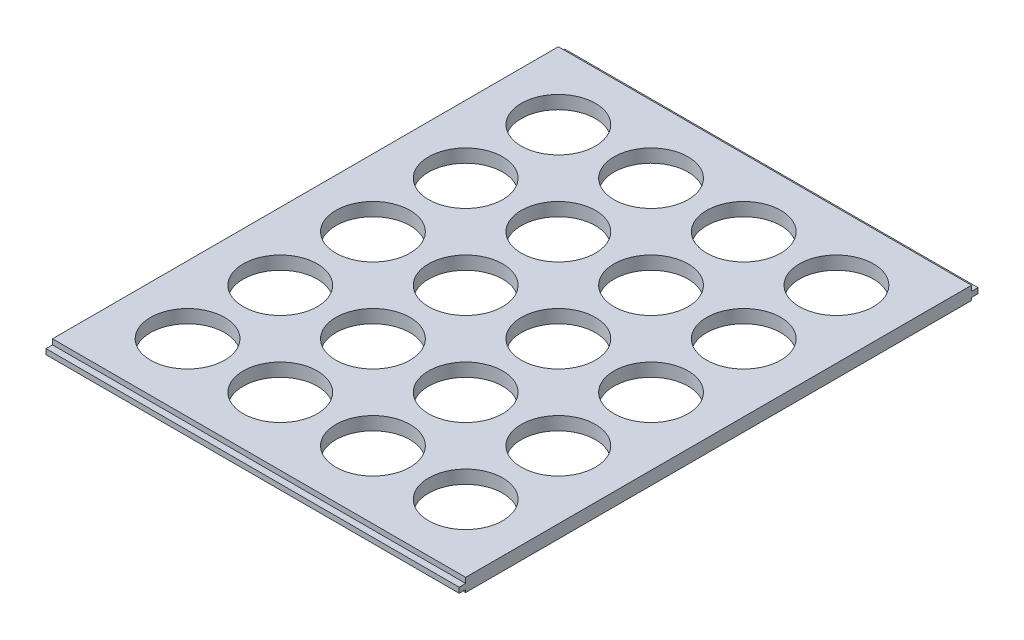
ISO-10303-21;
HEADER;
FILE_DESCRIPTION(('STEP AP214'),'2;1');
FILE_NAME('part.step','',(''),(''),'','','');
FILE_SCHEMA(('AUTOMOTIVE_DESIGN { 1 0 10303 214 1 1 1 1 }'));
ENDSEC;
DATA;
#1=APPLICATION_CONTEXT('core data for automotive mechanical design processes');
#2=APPLICATION_PROTOCOL_DEFINITION('international standard','automotive_design',2000,#1);
#3=PRODUCT_CONTEXT('',#1,'mechanical');
#4=PRODUCT('Part','Part','',(#3));
#5=PRODUCT_RELATED_PRODUCT_CATEGORY('part','',(#4));
#6=PRODUCT_DEFINITION_FORMATION('','',#4);
#7=PRODUCT_DEFINITION_CONTEXT('part definition',#1,'design');
#8=PRODUCT_DEFINITION('design','',#6,#7);
#9=PRODUCT_DEFINITION_SHAPE('','',#8);
#10=(LENGTH_UNIT() NAMED_UNIT(*) SI_UNIT(.MILLI.,.METRE.));
#11=(NAMED_UNIT(*) PLANE_ANGLE_UNIT() SI_UNIT($,.RADIAN.));
#12=(NAMED_UNIT(*) SI_UNIT($,.STERADIAN.) SOLID_ANGLE_UNIT());
#13=UNCERTAINTY_MEASURE_WITH_UNIT(LENGTH_MEASURE(1.E-05),#10,'distance_accuracy_value','');
#14=(GEOMETRIC_REPRESENTATION_CONTEXT(3) GLOBAL_UNCERTAINTY_ASSIGNED_CONTEXT((#13)) GLOBAL_UNIT_ASSIGNED_CONTEXT((#10,
#11,#12)) REPRESENTATION_CONTEXT('',''));
#15=CARTESIAN_POINT('',(0.,0.,0.));
#16=DIRECTION('',(0.,0.,1.));
#17=DIRECTION('',(1.,0.,0.));
#18=AXIS2_PLACEMENT_3D('',#15,#16,#17);
#19=CARTESIAN_POINT('',(0.,5.,0.));
#20=DIRECTION('',(0.,0.,1.));
#21=DIRECTION('',(1.,0.,0.));
#22=AXIS2_PLACEMENT_3D('',#19,#20,#21);
#23=PLANE('',#22);
#24=DIRECTION('',(1.,0.,0.));
#25=VECTOR('',#24,1.);
#26=CARTESIAN_POINT('',(156.,3.,0.));
#27=LINE('',#26,#25);
#28=CARTESIAN_POINT('',(0.,3.,0.));
#29=VERTEX_POINT('',#28);
#30=CARTESIAN_POINT('',(156.,3.,0.));
#31=VERTEX_POINT('',#30);
#32=EDGE_CURVE('E143',#29,#31,#27,.T.);
#33=ORIENTED_EDGE('',*,*,#32,.F.);
#34=DIRECTION('',(0.,-1.,0.));
#35=VECTOR('',#34,1.);
#36=CARTESIAN_POINT('',(0.,5.,0.));
#37=LINE('',#36,#35);
#38=CARTESIAN_POINT('',(0.,5.,0.));
#39=VERTEX_POINT('',#38);
#40=EDGE_CURVE('E321',#39,#29,#37,.T.);
#41=ORIENTED_EDGE('',*,*,#40,.F.);
#42=DIRECTION('',(-1.,0.,0.));
#43=VECTOR('',#42,1.);
#44=CARTESIAN_POINT('',(0.,5.,0.));
#45=LINE('',#44,#43);
#46=CARTESIAN_POINT('',(156.,5.,0.));
#47=VERTEX_POINT('',#46);
#48=EDGE_CURVE('E309',#47,#39,#45,.T.);
#49=ORIENTED_EDGE('',*,*,#48,.F.);
#50=DIRECTION('',(0.,-1.,0.));
#51=VECTOR('',#50,1.);
#52=CARTESIAN_POINT('',(156.,5.,0.));
#53=LINE('',#52,#51);
#54=EDGE_CURVE('E58',#47,#31,#53,.T.);
#55=ORIENTED_EDGE('',*,*,#54,.T.);
#56=EDGE_LOOP('',(#33,#41,#49,#55));
#57=FACE_BOUND('',#56,.T.);
#58=ADVANCED_FACE('F35',(#57),#23,.F.);
#59=DIRECTION('',(-1.,0.,0.));
#60=VECTOR('',#59,1.);
#61=CARTESIAN_POINT('',(0.,1.00000000000004,0.));
#62=LINE('',#61,#60);
#63=CARTESIAN_POINT('',(156.,1.00000000000003,0.));
#64=VERTEX_POINT('',#63);
#65=CARTESIAN_POINT('',(0.,1.00000000000004,0.));
#66=VERTEX_POINT('',#65);
#67=EDGE_CURVE('E50',#64,#66,#62,.T.);
#68=ORIENTED_EDGE('',*,*,#67,.F.);
#69=CARTESIAN_POINT('',(156.,0.,0.));
#70=VERTEX_POINT('',#69);
#71=EDGE_CURVE('E147',#64,#70,#53,.T.);
#72=ORIENTED_EDGE('',*,*,#71,.T.);
#73=DIRECTION('',(-1.,0.,0.));
#74=VECTOR('',#73,1.);
#75=CARTESIAN_POINT('',(0.,0.,0.));
#76=LINE('',#75,#74);
#77=CARTESIAN_POINT('',(0.,0.,0.));
#78=VERTEX_POINT('',#77);
#79=EDGE_CURVE('E305',#70,#78,#76,.T.);
#80=ORIENTED_EDGE('',*,*,#79,.T.);
#81=EDGE_CURVE('E311',#66,#78,#37,.T.);
#82=ORIENTED_EDGE('',*,*,#81,.F.);
#83=EDGE_LOOP('',(#68,#72,#80,#82));
#84=FACE_BOUND('',#83,.T.);
#85=ADVANCED_FACE('F342',(#84),#23,.F.);
#86=CARTESIAN_POINT('',(0.,5.,191.));
#87=DIRECTION('',(0.,0.,-1.));
#88=DIRECTION('',(-1.,0.,0.));
#89=AXIS2_PLACEMENT_3D('',#86,#87,#88);
#90=PLANE('',#89);
#91=DIRECTION('',(1.,0.,0.));
#92=VECTOR('',#91,1.);
#93=CARTESIAN_POINT('',(156.,1.,191.));
#94=LINE('',#93,#92);
#95=CARTESIAN_POINT('',(0.,0.99999999999999,191.));
#96=VERTEX_POINT('',#95);
#97=CARTESIAN_POINT('',(156.,0.99999999999999,191.));
#98=VERTEX_POINT('',#97);
#99=EDGE_CURVE('E151',#96,#98,#94,.T.);
#100=ORIENTED_EDGE('',*,*,#99,.F.);
#101=DIRECTION('',(0.,-1.,0.));
#102=VECTOR('',#101,1.);
#103=CARTESIAN_POINT('',(0.,5.,191.));
#104=LINE('',#103,#102);
#105=CARTESIAN_POINT('',(0.,0.,191.));
#106=VERTEX_POINT('',#105);
#107=EDGE_CURVE('E43',#96,#106,#104,.T.);
#108=ORIENTED_EDGE('',*,*,#107,.T.);
#109=DIRECTION('',(1.,0.,0.));
#110=VECTOR('',#109,1.);
#111=CARTESIAN_POINT('',(0.,0.,191.));
#112=LINE('',#111,#110);
#113=CARTESIAN_POINT('',(156.,0.,191.));
#114=VERTEX_POINT('',#113);
#115=EDGE_CURVE('E314',#106,#114,#112,.T.);
#116=ORIENTED_EDGE('',*,*,#115,.T.);
#117=DIRECTION('',(0.,-1.,0.));
#118=VECTOR('',#117,1.);
#119=CARTESIAN_POINT('',(156.,5.,191.));
#120=LINE('',#119,#118);
#121=EDGE_CURVE('E324',#98,#114,#120,.T.);
#122=ORIENTED_EDGE('',*,*,#121,.F.);
#123=EDGE_LOOP('',(#100,#108,#116,#122));
#124=FACE_BOUND('',#123,.T.);
#125=ADVANCED_FACE('F336',(#124),#90,.F.);
#126=DIRECTION('',(-1.,0.,0.));
#127=VECTOR('',#126,1.);
#128=CARTESIAN_POINT('',(156.,3.,191.));
#129=LINE('',#128,#127);
#130=CARTESIAN_POINT('',(156.,2.99999999999999,191.));
#131=VERTEX_POINT('',#130);
#132=CARTESIAN_POINT('',(0.,2.99999999999998,191.));
#133=VERTEX_POINT('',#132);
#134=EDGE_CURVE('E148',#131,#133,#129,.T.);
#135=ORIENTED_EDGE('',*,*,#134,.F.);
#136=CARTESIAN_POINT('',(156.,5.,191.));
#137=VERTEX_POINT('',#136);
#138=EDGE_CURVE('E325',#137,#131,#120,.T.);
#139=ORIENTED_EDGE('',*,*,#138,.F.);
#140=DIRECTION('',(1.,0.,0.));
#141=VECTOR('',#140,1.);
#142=CARTESIAN_POINT('',(0.,5.,191.));
#143=LINE('',#142,#141);
#144=CARTESIAN_POINT('',(0.,5.,191.));
#145=VERTEX_POINT('',#144);
#146=EDGE_CURVE('E304',#145,#137,#143,.T.);
#147=ORIENTED_EDGE('',*,*,#146,.F.);
#148=EDGE_CURVE('E11',#145,#133,#104,.T.);
#149=ORIENTED_EDGE('',*,*,#148,.T.);
#150=EDGE_LOOP('',(#135,#139,#147,#149));
#151=FACE_BOUND('',#150,.T.);
#152=ADVANCED_FACE('F361',(#151),#90,.F.);
#153=CARTESIAN_POINT('',(0.,5.,0.));
#154=DIRECTION('',(0.,1.,0.));
#155=DIRECTION('',(0.,0.,1.));
#156=AXIS2_PLACEMENT_3D('',#153,#154,#155);
#157=PLANE('',#156);
#158=CARTESIAN_POINT('',(25.4999999999997,5.,60.5));
#159=DIRECTION('',(0.,1.,0.));
#160=DIRECTION('',(0.,0.,1.));
#161=AXIS2_PLACEMENT_3D('',#158,#159,#160);
#162=CIRCLE('',#161,14.);
#163=CARTESIAN_POINT('',(25.4999999999997,5.,74.5));
#164=VERTEX_POINT('',#163);
#165=EDGE_CURVE('E187',#164,#164,#162,.T.);
#166=ORIENTED_EDGE('',*,*,#165,.F.);
#167=EDGE_LOOP('',(#166));
#168=FACE_BOUND('',#167,.T.);
#169=CARTESIAN_POINT('',(25.4999999999999,5.,130.5));
#170=DIRECTION('',(0.,1.,0.));
#171=DIRECTION('',(0.,0.,1.));
#172=AXIS2_PLACEMENT_3D('',#169,#170,#171);
#173=CIRCLE('',#172,14.);
#174=CARTESIAN_POINT('',(25.4999999999999,5.,144.5));
#175=VERTEX_POINT('',#174);
#176=EDGE_CURVE('E199',#175,#175,#173,.T.);
#177=ORIENTED_EDGE('',*,*,#176,.F.);
#178=EDGE_LOOP('',(#177));
#179=FACE_BOUND('',#178,.T.);
#180=CARTESIAN_POINT('',(95.4999999999995,5.,25.5));
#181=DIRECTION('',(0.,1.,0.));
#182=DIRECTION('',(0.,0.,1.));
#183=AXIS2_PLACEMENT_3D('',#180,#181,#182);
#184=CIRCLE('',#183,14.);
#185=CARTESIAN_POINT('',(95.4999999999995,5.,39.5));
#186=VERTEX_POINT('',#185);
#187=EDGE_CURVE('E211',#186,#186,#184,.T.);
#188=ORIENTED_EDGE('',*,*,#187,.F.);
#189=EDGE_LOOP('',(#188));
#190=FACE_BOUND('',#189,.T.);
#191=CARTESIAN_POINT('',(130.5,5.,60.5));
#192=DIRECTION('',(0.,1.,0.));
#193=DIRECTION('',(0.,0.,1.));
#194=AXIS2_PLACEMENT_3D('',#191,#192,#193);
#195=CIRCLE('',#194,14.);
#196=CARTESIAN_POINT('',(130.5,5.,74.5));
#197=VERTEX_POINT('',#196);
#198=EDGE_CURVE('E223',#197,#197,#195,.T.);
#199=ORIENTED_EDGE('',*,*,#198,.F.);
#200=EDGE_LOOP('',(#199));
#201=FACE_BOUND('',#200,.T.);
#202=CARTESIAN_POINT('',(60.4999999999997,5.,60.5));
#203=DIRECTION('',(0.,1.,0.));
#204=DIRECTION('',(0.,0.,1.));
#205=AXIS2_PLACEMENT_3D('',#202,#203,#204);
#206=CIRCLE('',#205,14.);
#207=CARTESIAN_POINT('',(60.4999999999997,5.,74.5));
#208=VERTEX_POINT('',#207);
#209=EDGE_CURVE('E235',#208,#208,#206,.T.);
#210=ORIENTED_EDGE('',*,*,#209,.F.);
#211=EDGE_LOOP('',(#210));
#212=FACE_BOUND('',#211,.T.);
#213=CARTESIAN_POINT('',(95.4999999999998,5.,95.5));
#214=DIRECTION('',(0.,1.,0.));
#215=DIRECTION('',(0.,0.,1.));
#216=AXIS2_PLACEMENT_3D('',#213,#214,#215);
#217=CIRCLE('',#216,14.);
#218=CARTESIAN_POINT('',(95.4999999999998,5.,109.5));
#219=VERTEX_POINT('',#218);
#220=EDGE_CURVE('E247',#219,#219,#217,.T.);
#221=ORIENTED_EDGE('',*,*,#220,.F.);
#222=EDGE_LOOP('',(#221));
#223=FACE_BOUND('',#222,.T.);
#224=CARTESIAN_POINT('',(130.5,5.,130.5));
#225=DIRECTION('',(0.,1.,0.));
#226=DIRECTION('',(0.,0.,1.));
#227=AXIS2_PLACEMENT_3D('',#224,#225,#226);
#228=CIRCLE('',#227,14.);
#229=CARTESIAN_POINT('',(130.5,5.,144.5));
#230=VERTEX_POINT('',#229);
#231=EDGE_CURVE('E259',#230,#230,#228,.T.);
#232=ORIENTED_EDGE('',*,*,#231,.F.);
#233=EDGE_LOOP('',(#232));
#234=FACE_BOUND('',#233,.T.);
#235=CARTESIAN_POINT('',(60.4999999999999,5.,130.5));
#236=DIRECTION('',(0.,1.,0.));
#237=DIRECTION('',(0.,0.,1.));
#238=AXIS2_PLACEMENT_3D('',#235,#236,#237);
#239=CIRCLE('',#238,14.);
#240=CARTESIAN_POINT('',(60.4999999999999,5.,144.5));
#241=VERTEX_POINT('',#240);
#242=EDGE_CURVE('E271',#241,#241,#239,.T.);
#243=ORIENTED_EDGE('',*,*,#242,.F.);
#244=EDGE_LOOP('',(#243));
#245=FACE_BOUND('',#244,.T.);
#246=CARTESIAN_POINT('',(95.5,5.,165.5));
#247=DIRECTION('',(0.,1.,0.));
#248=DIRECTION('',(0.,0.,1.));
#249=AXIS2_PLACEMENT_3D('',#246,#247,#248);
#250=CIRCLE('',#249,14.);
#251=CARTESIAN_POINT('',(95.5,5.,179.5));
#252=VERTEX_POINT('',#251);
#253=EDGE_CURVE('E283',#252,#252,#250,.T.);
#254=ORIENTED_EDGE('',*,*,#253,.F.);
#255=EDGE_LOOP('',(#254));
#256=FACE_BOUND('',#255,.T.);
#257=CARTESIAN_POINT('',(25.5,5.,165.5));
#258=DIRECTION('',(0.,1.,0.));
#259=DIRECTION('',(0.,0.,1.));
#260=AXIS2_PLACEMENT_3D('',#257,#258,#259);
#261=CIRCLE('',#260,14.);
#262=CARTESIAN_POINT('',(25.5,5.,179.5));
#263=VERTEX_POINT('',#262);
#264=EDGE_CURVE('E295',#263,#263,#261,.T.);
#265=ORIENTED_EDGE('',*,*,#264,.F.);
#266=EDGE_LOOP('',(#265));
#267=FACE_BOUND('',#266,.T.);
#268=DIRECTION('',(0.,0.,1.));
#269=VECTOR('',#268,1.);
#270=CARTESIAN_POINT('',(0.,5.,0.));
#271=LINE('',#270,#269);
#272=EDGE_CURVE('E301',#39,#145,#271,.T.);
#273=ORIENTED_EDGE('',*,*,#272,.T.);
#274=ORIENTED_EDGE('',*,*,#146,.T.);
#275=DIRECTION('',(0.,0.,-1.));
#276=VECTOR('',#275,1.);
#277=CARTESIAN_POINT('',(156.,5.,0.));
#278=LINE('',#277,#276);
#279=EDGE_CURVE('E307',#137,#47,#278,.T.);
#280=ORIENTED_EDGE('',*,*,#279,.T.);
#281=ORIENTED_EDGE('',*,*,#48,.T.);
#282=EDGE_LOOP('',(#273,#274,#280,#281));
#283=FACE_BOUND('',#282,.T.);
#284=CARTESIAN_POINT('',(60.5,5.,165.5));
#285=DIRECTION('',(0.,1.,0.));
#286=DIRECTION('',(0.,0.,1.));
#287=AXIS2_PLACEMENT_3D('',#284,#285,#286);
#288=CIRCLE('',#287,14.);
#289=CARTESIAN_POINT('',(60.5,5.,179.5));
#290=VERTEX_POINT('',#289);
#291=EDGE_CURVE('E289',#290,#290,#288,.T.);
#292=ORIENTED_EDGE('',*,*,#291,.F.);
#293=EDGE_LOOP('',(#292));
#294=FACE_BOUND('',#293,.T.);
#295=CARTESIAN_POINT('',(130.5,5.,165.5));
#296=DIRECTION('',(0.,1.,0.));
#297=DIRECTION('',(0.,0.,1.));
#298=AXIS2_PLACEMENT_3D('',#295,#296,#297);
#299=CIRCLE('',#298,14.);
#300=CARTESIAN_POINT('',(130.5,5.,179.5));
#301=VERTEX_POINT('',#300);
#302=EDGE_CURVE('E277',#301,#301,#299,.T.);
#303=ORIENTED_EDGE('',*,*,#302,.F.);
#304=EDGE_LOOP('',(#303));
#305=FACE_BOUND('',#304,.T.);
#306=CARTESIAN_POINT('',(95.4999999999999,5.,130.5));
#307=DIRECTION('',(0.,1.,0.));
#308=DIRECTION('',(0.,0.,1.));
#309=AXIS2_PLACEMENT_3D('',#306,#307,#308);
#310=CIRCLE('',#309,14.);
#311=CARTESIAN_POINT('',(95.4999999999999,5.,144.5));
#312=VERTEX_POINT('',#311);
#313=EDGE_CURVE('E265',#312,#312,#310,.T.);
#314=ORIENTED_EDGE('',*,*,#313,.F.);
#315=EDGE_LOOP('',(#314));
#316=FACE_BOUND('',#315,.T.);
#317=CARTESIAN_POINT('',(60.4999999999998,5.,95.5));
#318=DIRECTION('',(0.,1.,0.));
#319=DIRECTION('',(0.,0.,1.));
#320=AXIS2_PLACEMENT_3D('',#317,#318,#319);
#321=CIRCLE('',#320,14.);
#322=CARTESIAN_POINT('',(60.4999999999998,5.,109.5));
#323=VERTEX_POINT('',#322);
#324=EDGE_CURVE('E253',#323,#323,#321,.T.);
#325=ORIENTED_EDGE('',*,*,#324,.F.);
#326=EDGE_LOOP('',(#325));
#327=FACE_BOUND('',#326,.T.);
#328=CARTESIAN_POINT('',(130.5,5.,95.5));
#329=DIRECTION('',(0.,1.,0.));
#330=DIRECTION('',(0.,0.,1.));
#331=AXIS2_PLACEMENT_3D('',#328,#329,#330);
#332=CIRCLE('',#331,14.);
#333=CARTESIAN_POINT('',(130.5,5.,109.5));
#334=VERTEX_POINT('',#333);
#335=EDGE_CURVE('E241',#334,#334,#332,.T.);
#336=ORIENTED_EDGE('',*,*,#335,.F.);
#337=EDGE_LOOP('',(#336));
#338=FACE_BOUND('',#337,.T.);
#339=CARTESIAN_POINT('',(95.4999999999997,5.,60.5));
#340=DIRECTION('',(0.,1.,0.));
#341=DIRECTION('',(0.,0.,1.));
#342=AXIS2_PLACEMENT_3D('',#339,#340,#341);
#343=CIRCLE('',#342,14.);
#344=CARTESIAN_POINT('',(95.4999999999997,5.,74.5));
#345=VERTEX_POINT('',#344);
#346=EDGE_CURVE('E229',#345,#345,#343,.T.);
#347=ORIENTED_EDGE('',*,*,#346,.F.);
#348=EDGE_LOOP('',(#347));
#349=FACE_BOUND('',#348,.T.);
#350=CARTESIAN_POINT('',(60.4999999999995,5.,25.5));
#351=DIRECTION('',(0.,1.,0.));
#352=DIRECTION('',(0.,0.,1.));
#353=AXIS2_PLACEMENT_3D('',#350,#351,#352);
#354=CIRCLE('',#353,14.);
#355=CARTESIAN_POINT('',(60.4999999999995,5.,39.5));
#356=VERTEX_POINT('',#355);
#357=EDGE_CURVE('E217',#356,#356,#354,.T.);
#358=ORIENTED_EDGE('',*,*,#357,.F.);
#359=EDGE_LOOP('',(#358));
#360=FACE_BOUND('',#359,.T.);
#361=CARTESIAN_POINT('',(130.5,5.,25.5));
#362=DIRECTION('',(0.,1.,0.));
#363=DIRECTION('',(0.,0.,1.));
#364=AXIS2_PLACEMENT_3D('',#361,#362,#363);
#365=CIRCLE('',#364,14.);
#366=CARTESIAN_POINT('',(130.5,5.,39.5));
#367=VERTEX_POINT('',#366);
#368=EDGE_CURVE('E205',#367,#367,#365,.T.);
#369=ORIENTED_EDGE('',*,*,#368,.F.);
#370=EDGE_LOOP('',(#369));
#371=FACE_BOUND('',#370,.T.);
#372=CARTESIAN_POINT('',(25.4999999999998,5.,95.5));
#373=DIRECTION('',(0.,1.,0.));
#374=DIRECTION('',(0.,0.,1.));
#375=AXIS2_PLACEMENT_3D('',#372,#373,#374);
#376=CIRCLE('',#375,14.);
#377=CARTESIAN_POINT('',(25.4999999999998,5.,109.5));
#378=VERTEX_POINT('',#377);
#379=EDGE_CURVE('E193',#378,#378,#376,.T.);
#380=ORIENTED_EDGE('',*,*,#379,.F.);
#381=EDGE_LOOP('',(#380));
#382=FACE_BOUND('',#381,.T.);
#383=CARTESIAN_POINT('',(25.4999999999995,5.,25.5));
#384=DIRECTION('',(0.,1.,0.));
#385=DIRECTION('',(0.,0.,1.));
#386=AXIS2_PLACEMENT_3D('',#383,#384,#385);
#387=CIRCLE('',#386,14.);
#388=CARTESIAN_POINT('',(25.4999999999995,5.,39.5));
#389=VERTEX_POINT('',#388);
#390=EDGE_CURVE('E181',#389,#389,#387,.T.);
#391=ORIENTED_EDGE('',*,*,#390,.F.);
#392=EDGE_LOOP('',(#391));
#393=FACE_BOUND('',#392,.T.);
#394=ADVANCED_FACE('F357',(#168,#179,#190,#201,#212,#223,#234,#245,#256,#267,#283,#294,#305,
#316,#327,#338,#349,#360,#371,#382,#393),#157,.T.);
#395=CARTESIAN_POINT('',(0.,0.,0.));
#396=DIRECTION('',(0.,1.,0.));
#397=DIRECTION('',(0.,0.,1.));
#398=AXIS2_PLACEMENT_3D('',#395,#396,#397);
#399=PLANE('',#398);
#400=DIRECTION('',(0.,0.,1.));
#401=VECTOR('',#400,1.);
#402=CARTESIAN_POINT('',(0.,0.,0.));
#403=LINE('',#402,#401);
#404=EDGE_CURVE('E298',#78,#106,#403,.T.);
#405=ORIENTED_EDGE('',*,*,#404,.F.);
#406=ORIENTED_EDGE('',*,*,#79,.F.);
#407=DIRECTION('',(0.,0.,-1.));
#408=VECTOR('',#407,1.);
#409=CARTESIAN_POINT('',(156.,0.,0.));
#410=LINE('',#409,#408);
#411=EDGE_CURVE('E317',#114,#70,#410,.T.);
#412=ORIENTED_EDGE('',*,*,#411,.F.);
#413=ORIENTED_EDGE('',*,*,#115,.F.);
#414=EDGE_LOOP('',(#405,#406,#412,#413));
#415=FACE_BOUND('',#414,.T.);
#416=CARTESIAN_POINT('',(25.5,0.,165.5));
#417=DIRECTION('',(0.,1.,0.));
#418=DIRECTION('',(0.,0.,1.));
#419=AXIS2_PLACEMENT_3D('',#416,#417,#418);
#420=CIRCLE('',#419,14.);
#421=CARTESIAN_POINT('',(25.5,0.,179.5));
#422=VERTEX_POINT('',#421);
#423=EDGE_CURVE('E292',#422,#422,#420,.T.);
#424=ORIENTED_EDGE('',*,*,#423,.T.);
#425=EDGE_LOOP('',(#424));
#426=FACE_BOUND('',#425,.T.);
#427=CARTESIAN_POINT('',(60.5,0.,165.5));
#428=DIRECTION('',(0.,1.,0.));
#429=DIRECTION('',(0.,0.,1.));
#430=AXIS2_PLACEMENT_3D('',#427,#428,#429);
#431=CIRCLE('',#430,14.);
#432=CARTESIAN_POINT('',(60.5,0.,179.5));
#433=VERTEX_POINT('',#432);
#434=EDGE_CURVE('E286',#433,#433,#431,.T.);
#435=ORIENTED_EDGE('',*,*,#434,.T.);
#436=EDGE_LOOP('',(#435));
#437=FACE_BOUND('',#436,.T.);
#438=CARTESIAN_POINT('',(95.5,0.,165.5));
#439=DIRECTION('',(0.,1.,0.));
#440=DIRECTION('',(0.,0.,1.));
#441=AXIS2_PLACEMENT_3D('',#438,#439,#440);
#442=CIRCLE('',#441,14.);
#443=CARTESIAN_POINT('',(95.5,0.,179.5));
#444=VERTEX_POINT('',#443);
#445=EDGE_CURVE('E280',#444,#444,#442,.T.);
#446=ORIENTED_EDGE('',*,*,#445,.T.);
#447=EDGE_LOOP('',(#446));
#448=FACE_BOUND('',#447,.T.);
#449=CARTESIAN_POINT('',(130.5,0.,165.5));
#450=DIRECTION('',(0.,1.,0.));
#451=DIRECTION('',(0.,0.,1.));
#452=AXIS2_PLACEMENT_3D('',#449,#450,#451);
#453=CIRCLE('',#452,14.);
#454=CARTESIAN_POINT('',(130.5,0.,179.5));
#455=VERTEX_POINT('',#454);
#456=EDGE_CURVE('E274',#455,#455,#453,.T.);
#457=ORIENTED_EDGE('',*,*,#456,.T.);
#458=EDGE_LOOP('',(#457));
#459=FACE_BOUND('',#458,.T.);
#460=CARTESIAN_POINT('',(60.4999999999999,0.,130.5));
#461=DIRECTION('',(0.,1.,0.));
#462=DIRECTION('',(0.,0.,1.));
#463=AXIS2_PLACEMENT_3D('',#460,#461,#462);
#464=CIRCLE('',#463,14.);
#465=CARTESIAN_POINT('',(60.4999999999999,0.,144.5));
#466=VERTEX_POINT('',#465);
#467=EDGE_CURVE('E268',#466,#466,#464,.T.);
#468=ORIENTED_EDGE('',*,*,#467,.T.);
#469=EDGE_LOOP('',(#468));
#470=FACE_BOUND('',#469,.T.);
#471=CARTESIAN_POINT('',(95.4999999999999,0.,130.5));
#472=DIRECTION('',(0.,1.,0.));
#473=DIRECTION('',(0.,0.,1.));
#474=AXIS2_PLACEMENT_3D('',#471,#472,#473);
#475=CIRCLE('',#474,14.);
#476=CARTESIAN_POINT('',(95.4999999999999,0.,144.5));
#477=VERTEX_POINT('',#476);
#478=EDGE_CURVE('E262',#477,#477,#475,.T.);
#479=ORIENTED_EDGE('',*,*,#478,.T.);
#480=EDGE_LOOP('',(#479));
#481=FACE_BOUND('',#480,.T.);
#482=CARTESIAN_POINT('',(130.5,0.,130.5));
#483=DIRECTION('',(0.,1.,0.));
#484=DIRECTION('',(0.,0.,1.));
#485=AXIS2_PLACEMENT_3D('',#482,#483,#484);
#486=CIRCLE('',#485,14.);
#487=CARTESIAN_POINT('',(130.5,0.,144.5));
#488=VERTEX_POINT('',#487);
#489=EDGE_CURVE('E256',#488,#488,#486,.T.);
#490=ORIENTED_EDGE('',*,*,#489,.T.);
#491=EDGE_LOOP('',(#490));
#492=FACE_BOUND('',#491,.T.);
#493=CARTESIAN_POINT('',(60.4999999999998,0.,95.5));
#494=DIRECTION('',(0.,1.,0.));
#495=DIRECTION('',(0.,0.,1.));
#496=AXIS2_PLACEMENT_3D('',#493,#494,#495);
#497=CIRCLE('',#496,14.);
#498=CARTESIAN_POINT('',(60.4999999999998,0.,109.5));
#499=VERTEX_POINT('',#498);
#500=EDGE_CURVE('E250',#499,#499,#497,.T.);
#501=ORIENTED_EDGE('',*,*,#500,.T.);
#502=EDGE_LOOP('',(#501));
#503=FACE_BOUND('',#502,.T.);
#504=CARTESIAN_POINT('',(95.4999999999998,0.,95.5));
#505=DIRECTION('',(0.,1.,0.));
#506=DIRECTION('',(0.,0.,1.));
#507=AXIS2_PLACEMENT_3D('',#504,#505,#506);
#508=CIRCLE('',#507,14.);
#509=CARTESIAN_POINT('',(95.4999999999998,0.,109.5));
#510=VERTEX_POINT('',#509);
#511=EDGE_CURVE('E244',#510,#510,#508,.T.);
#512=ORIENTED_EDGE('',*,*,#511,.T.);
#513=EDGE_LOOP('',(#512));
#514=FACE_BOUND('',#513,.T.);
#515=CARTESIAN_POINT('',(130.5,0.,95.5));
#516=DIRECTION('',(0.,1.,0.));
#517=DIRECTION('',(0.,0.,1.));
#518=AXIS2_PLACEMENT_3D('',#515,#516,#517);
#519=CIRCLE('',#518,14.);
#520=CARTESIAN_POINT('',(130.5,0.,109.5));
#521=VERTEX_POINT('',#520);
#522=EDGE_CURVE('E238',#521,#521,#519,.T.);
#523=ORIENTED_EDGE('',*,*,#522,.T.);
#524=EDGE_LOOP('',(#523));
#525=FACE_BOUND('',#524,.T.);
#526=CARTESIAN_POINT('',(60.4999999999997,0.,60.5));
#527=DIRECTION('',(0.,1.,0.));
#528=DIRECTION('',(0.,0.,1.));
#529=AXIS2_PLACEMENT_3D('',#526,#527,#528);
#530=CIRCLE('',#529,14.);
#531=CARTESIAN_POINT('',(60.4999999999997,0.,74.5));
#532=VERTEX_POINT('',#531);
#533=EDGE_CURVE('E232',#532,#532,#530,.T.);
#534=ORIENTED_EDGE('',*,*,#533,.T.);
#535=EDGE_LOOP('',(#534));
#536=FACE_BOUND('',#535,.T.);
#537=CARTESIAN_POINT('',(95.4999999999997,0.,60.5));
#538=DIRECTION('',(0.,1.,0.));
#539=DIRECTION('',(0.,0.,1.));
#540=AXIS2_PLACEMENT_3D('',#537,#538,#539);
#541=CIRCLE('',#540,14.);
#542=CARTESIAN_POINT('',(95.4999999999997,0.,74.5));
#543=VERTEX_POINT('',#542);
#544=EDGE_CURVE('E226',#543,#543,#541,.T.);
#545=ORIENTED_EDGE('',*,*,#544,.T.);
#546=EDGE_LOOP('',(#545));
#547=FACE_BOUND('',#546,.T.);
#548=CARTESIAN_POINT('',(130.5,0.,60.5));
#549=DIRECTION('',(0.,1.,0.));
#550=DIRECTION('',(0.,0.,1.));
#551=AXIS2_PLACEMENT_3D('',#548,#549,#550);
#552=CIRCLE('',#551,14.);
#553=CARTESIAN_POINT('',(130.5,0.,74.5));
#554=VERTEX_POINT('',#553);
#555=EDGE_CURVE('E220',#554,#554,#552,.T.);
#556=ORIENTED_EDGE('',*,*,#555,.T.);
#557=EDGE_LOOP('',(#556));
#558=FACE_BOUND('',#557,.T.);
#559=CARTESIAN_POINT('',(60.4999999999995,0.,25.5));
#560=DIRECTION('',(0.,1.,0.));
#561=DIRECTION('',(0.,0.,1.));
#562=AXIS2_PLACEMENT_3D('',#559,#560,#561);
#563=CIRCLE('',#562,14.);
#564=CARTESIAN_POINT('',(60.4999999999995,0.,39.5));
#565=VERTEX_POINT('',#564);
#566=EDGE_CURVE('E214',#565,#565,#563,.T.);
#567=ORIENTED_EDGE('',*,*,#566,.T.);
#568=EDGE_LOOP('',(#567));
#569=FACE_BOUND('',#568,.T.);
#570=CARTESIAN_POINT('',(95.4999999999995,0.,25.5));
#571=DIRECTION('',(0.,1.,0.));
#572=DIRECTION('',(0.,0.,1.));
#573=AXIS2_PLACEMENT_3D('',#570,#571,#572);
#574=CIRCLE('',#573,14.);
#575=CARTESIAN_POINT('',(95.4999999999995,0.,39.5));
#576=VERTEX_POINT('',#575);
#577=EDGE_CURVE('E208',#576,#576,#574,.T.);
#578=ORIENTED_EDGE('',*,*,#577,.T.);
#579=EDGE_LOOP('',(#578));
#580=FACE_BOUND('',#579,.T.);
#581=CARTESIAN_POINT('',(130.5,0.,25.5));
#582=DIRECTION('',(0.,1.,0.));
#583=DIRECTION('',(0.,0.,1.));
#584=AXIS2_PLACEMENT_3D('',#581,#582,#583);
#585=CIRCLE('',#584,14.);
#586=CARTESIAN_POINT('',(130.5,0.,39.5));
#587=VERTEX_POINT('',#586);
#588=EDGE_CURVE('E202',#587,#587,#585,.T.);
#589=ORIENTED_EDGE('',*,*,#588,.T.);
#590=EDGE_LOOP('',(#589));
#591=FACE_BOUND('',#590,.T.);
#592=CARTESIAN_POINT('',(25.4999999999999,0.,130.5));
#593=DIRECTION('',(0.,1.,0.));
#594=DIRECTION('',(0.,0.,1.));
#595=AXIS2_PLACEMENT_3D('',#592,#593,#594);
#596=CIRCLE('',#595,14.);
#597=CARTESIAN_POINT('',(25.4999999999999,0.,144.5));
#598=VERTEX_POINT('',#597);
#599=EDGE_CURVE('E196',#598,#598,#596,.T.);
#600=ORIENTED_EDGE('',*,*,#599,.T.);
#601=EDGE_LOOP('',(#600));
#602=FACE_BOUND('',#601,.T.);
#603=CARTESIAN_POINT('',(25.4999999999998,0.,95.5));
#604=DIRECTION('',(0.,1.,0.));
#605=DIRECTION('',(0.,0.,1.));
#606=AXIS2_PLACEMENT_3D('',#603,#604,#605);
#607=CIRCLE('',#606,14.);
#608=CARTESIAN_POINT('',(25.4999999999998,0.,109.5));
#609=VERTEX_POINT('',#608);
#610=EDGE_CURVE('E190',#609,#609,#607,.T.);
#611=ORIENTED_EDGE('',*,*,#610,.T.);
#612=EDGE_LOOP('',(#611));
#613=FACE_BOUND('',#612,.T.);
#614=CARTESIAN_POINT('',(25.4999999999997,0.,60.5));
#615=DIRECTION('',(0.,1.,0.));
#616=DIRECTION('',(0.,0.,1.));
#617=AXIS2_PLACEMENT_3D('',#614,#615,#616);
#618=CIRCLE('',#617,14.);
#619=CARTESIAN_POINT('',(25.4999999999997,0.,74.5));
#620=VERTEX_POINT('',#619);
#621=EDGE_CURVE('E184',#620,#620,#618,.T.);
#622=ORIENTED_EDGE('',*,*,#621,.T.);
#623=EDGE_LOOP('',(#622));
#624=FACE_BOUND('',#623,.T.);
#625=CARTESIAN_POINT('',(25.4999999999995,0.,25.5));
#626=DIRECTION('',(0.,1.,0.));
#627=DIRECTION('',(0.,0.,1.));
#628=AXIS2_PLACEMENT_3D('',#625,#626,#627);
#629=CIRCLE('',#628,14.);
#630=CARTESIAN_POINT('',(25.4999999999995,0.,39.5));
#631=VERTEX_POINT('',#630);
#632=EDGE_CURVE('E180',#631,#631,#629,.T.);
#633=ORIENTED_EDGE('',*,*,#632,.T.);
#634=EDGE_LOOP('',(#633));
#635=FACE_BOUND('',#634,.T.);
#636=ADVANCED_FACE('F340',(#415,#426,#437,#448,#459,#470,#481,#492,#503,#514,#525,#536,#547,
#558,#569,#580,#591,#602,#613,#624,#635),#399,.F.);
#637=CARTESIAN_POINT('',(0.,5.,0.));
#638=DIRECTION('',(1.,0.,0.));
#639=DIRECTION('',(0.,0.,-1.));
#640=AXIS2_PLACEMENT_3D('',#637,#638,#639);
#641=PLANE('',#640);
#642=ORIENTED_EDGE('',*,*,#404,.T.);
#643=ORIENTED_EDGE('',*,*,#107,.F.);
#644=DIRECTION('',(0.,0.,-1.));
#645=VECTOR('',#644,1.);
#646=CARTESIAN_POINT('',(0.,0.999999999999981,193.45));
#647=LINE('',#646,#645);
#648=CARTESIAN_POINT('',(0.,0.999999999999981,193.45));
#649=VERTEX_POINT('',#648);
#650=EDGE_CURVE('E171',#649,#96,#647,.T.);
#651=ORIENTED_EDGE('',*,*,#650,.F.);
#652=DIRECTION('',(0.,-1.,0.));
#653=VECTOR('',#652,1.);
#654=CARTESIAN_POINT('',(0.,0.999999999999981,193.45));
#655=LINE('',#654,#653);
#656=CARTESIAN_POINT('',(0.,2.99999999999998,193.45));
#657=VERTEX_POINT('',#656);
#658=EDGE_CURVE('E162',#657,#649,#655,.T.);
#659=ORIENTED_EDGE('',*,*,#658,.F.);
#660=DIRECTION('',(0.,0.,-1.));
#661=VECTOR('',#660,1.);
#662=CARTESIAN_POINT('',(0.,2.99999999999998,193.45));
#663=LINE('',#662,#661);
#664=EDGE_CURVE('E174',#657,#133,#663,.T.);
#665=ORIENTED_EDGE('',*,*,#664,.T.);
#666=ORIENTED_EDGE('',*,*,#148,.F.);
#667=ORIENTED_EDGE('',*,*,#272,.F.);
#668=ORIENTED_EDGE('',*,*,#40,.T.);
#669=DIRECTION('',(0.,0.,1.));
#670=VECTOR('',#669,1.);
#671=CARTESIAN_POINT('',(0.,3.,-2.45));
#672=LINE('',#671,#670);
#673=CARTESIAN_POINT('',(0.,3.,-2.45));
#674=VERTEX_POINT('',#673);
#675=EDGE_CURVE('E153',#674,#29,#672,.T.);
#676=ORIENTED_EDGE('',*,*,#675,.F.);
#677=DIRECTION('',(0.,1.,0.));
#678=VECTOR('',#677,1.);
#679=CARTESIAN_POINT('',(0.,3.,-2.45));
#680=LINE('',#679,#678);
#681=CARTESIAN_POINT('',(0.,1.00000000000004,-2.45));
#682=VERTEX_POINT('',#681);
#683=EDGE_CURVE('E133',#682,#674,#680,.T.);
#684=ORIENTED_EDGE('',*,*,#683,.F.);
#685=DIRECTION('',(0.,0.,1.));
#686=VECTOR('',#685,1.);
#687=CARTESIAN_POINT('',(0.,1.00000000000004,-2.45));
#688=LINE('',#687,#686);
#689=EDGE_CURVE('E130',#682,#66,#688,.T.);
#690=ORIENTED_EDGE('',*,*,#689,.T.);
#691=ORIENTED_EDGE('',*,*,#81,.T.);
#692=EDGE_LOOP('',(#642,#643,#651,#659,#665,#666,#667,#668,#676,#684,#690,#691));
#693=FACE_BOUND('',#692,.T.);
#694=ADVANCED_FACE('F37',(#693),#641,.F.);
#695=CARTESIAN_POINT('',(156.,5.,0.));
#696=DIRECTION('',(-1.,0.,0.));
#697=DIRECTION('',(0.,0.,1.));
#698=AXIS2_PLACEMENT_3D('',#695,#696,#697);
#699=PLANE('',#698);
#700=ORIENTED_EDGE('',*,*,#411,.T.);
#701=ORIENTED_EDGE('',*,*,#71,.F.);
#702=DIRECTION('',(0.,0.,1.));
#703=VECTOR('',#702,1.);
#704=CARTESIAN_POINT('',(156.,1.00000000000002,-2.45));
#705=LINE('',#704,#703);
#706=CARTESIAN_POINT('',(156.,1.00000000000002,-2.45));
#707=VERTEX_POINT('',#706);
#708=EDGE_CURVE('E128',#707,#64,#705,.T.);
#709=ORIENTED_EDGE('',*,*,#708,.F.);
#710=DIRECTION('',(0.,-1.,0.));
#711=VECTOR('',#710,1.);
#712=CARTESIAN_POINT('',(156.,1.00000000000002,-2.45));
#713=LINE('',#712,#711);
#714=CARTESIAN_POINT('',(156.,3.,-2.45));
#715=VERTEX_POINT('',#714);
#716=EDGE_CURVE('E134',#715,#707,#713,.T.);
#717=ORIENTED_EDGE('',*,*,#716,.F.);
#718=DIRECTION('',(0.,0.,1.));
#719=VECTOR('',#718,1.);
#720=CARTESIAN_POINT('',(156.,3.,-2.45));
#721=LINE('',#720,#719);
#722=EDGE_CURVE('E348',#715,#31,#721,.T.);
#723=ORIENTED_EDGE('',*,*,#722,.T.);
#724=ORIENTED_EDGE('',*,*,#54,.F.);
#725=ORIENTED_EDGE('',*,*,#279,.F.);
#726=ORIENTED_EDGE('',*,*,#138,.T.);
#727=DIRECTION('',(0.,0.,-1.));
#728=VECTOR('',#727,1.);
#729=CARTESIAN_POINT('',(156.,3.,193.45));
#730=LINE('',#729,#728);
#731=CARTESIAN_POINT('',(156.,3.,193.45));
#732=VERTEX_POINT('',#731);
#733=EDGE_CURVE('E177',#732,#131,#730,.T.);
#734=ORIENTED_EDGE('',*,*,#733,.F.);
#735=DIRECTION('',(0.,1.,0.));
#736=VECTOR('',#735,1.);
#737=CARTESIAN_POINT('',(156.,3.,193.45));
#738=LINE('',#737,#736);
#739=CARTESIAN_POINT('',(156.,1.,193.45));
#740=VERTEX_POINT('',#739);
#741=EDGE_CURVE('E157',#740,#732,#738,.T.);
#742=ORIENTED_EDGE('',*,*,#741,.F.);
#743=DIRECTION('',(0.,0.,-1.));
#744=VECTOR('',#743,1.);
#745=CARTESIAN_POINT('',(156.,1.,193.45));
#746=LINE('',#745,#744);
#747=EDGE_CURVE('E165',#740,#98,#746,.T.);
#748=ORIENTED_EDGE('',*,*,#747,.T.);
#749=ORIENTED_EDGE('',*,*,#121,.T.);
#750=EDGE_LOOP('',(#700,#701,#709,#717,#723,#724,#725,#726,#734,#742,#748,#749));
#751=FACE_BOUND('',#750,.T.);
#752=ADVANCED_FACE('F146',(#751),#699,.F.);
#753=CARTESIAN_POINT('',(25.5,5.,165.5));
#754=DIRECTION('',(0.,-1.,0.));
#755=DIRECTION('',(0.,0.,-1.));
#756=AXIS2_PLACEMENT_3D('',#753,#754,#755);
#757=CYLINDRICAL_SURFACE('',#756,14.);
#758=ORIENTED_EDGE('',*,*,#264,.T.);
#759=EDGE_LOOP('',(#758));
#760=FACE_BOUND('',#759,.T.);
#761=ORIENTED_EDGE('',*,*,#423,.F.);
#762=EDGE_LOOP('',(#761));
#763=FACE_BOUND('',#762,.T.);
#764=ADVANCED_FACE('F390',(#760,#763),#757,.F.);
#765=CARTESIAN_POINT('',(60.5,5.,165.5));
#766=DIRECTION('',(0.,-1.,0.));
#767=DIRECTION('',(0.,0.,-1.));
#768=AXIS2_PLACEMENT_3D('',#765,#766,#767);
#769=CYLINDRICAL_SURFACE('',#768,14.);
#770=ORIENTED_EDGE('',*,*,#291,.T.);
#771=EDGE_LOOP('',(#770));
#772=FACE_BOUND('',#771,.T.);
#773=ORIENTED_EDGE('',*,*,#434,.F.);
#774=EDGE_LOOP('',(#773));
#775=FACE_BOUND('',#774,.T.);
#776=ADVANCED_FACE('F407',(#772,#775),#769,.F.);
#777=CARTESIAN_POINT('',(95.5,5.,165.5));
#778=DIRECTION('',(0.,-1.,0.));
#779=DIRECTION('',(0.,0.,-1.));
#780=AXIS2_PLACEMENT_3D('',#777,#778,#779);
#781=CYLINDRICAL_SURFACE('',#780,14.);
#782=ORIENTED_EDGE('',*,*,#253,.T.);
#783=EDGE_LOOP('',(#782));
#784=FACE_BOUND('',#783,.T.);
#785=ORIENTED_EDGE('',*,*,#445,.F.);
#786=EDGE_LOOP('',(#785));
#787=FACE_BOUND('',#786,.T.);
#788=ADVANCED_FACE('F411',(#784,#787),#781,.F.);
#789=CARTESIAN_POINT('',(130.5,5.,165.5));
#790=DIRECTION('',(0.,-1.,0.));
#791=DIRECTION('',(0.,0.,-1.));
#792=AXIS2_PLACEMENT_3D('',#789,#790,#791);
#793=CYLINDRICAL_SURFACE('',#792,14.);
#794=ORIENTED_EDGE('',*,*,#302,.T.);
#795=EDGE_LOOP('',(#794));
#796=FACE_BOUND('',#795,.T.);
#797=ORIENTED_EDGE('',*,*,#456,.F.);
#798=EDGE_LOOP('',(#797));
#799=FACE_BOUND('',#798,.T.);
#800=ADVANCED_FACE('F415',(#796,#799),#793,.F.);
#801=CARTESIAN_POINT('',(60.4999999999999,5.,130.5));
#802=DIRECTION('',(0.,-1.,0.));
#803=DIRECTION('',(0.,0.,-1.));
#804=AXIS2_PLACEMENT_3D('',#801,#802,#803);
#805=CYLINDRICAL_SURFACE('',#804,14.);
#806=ORIENTED_EDGE('',*,*,#242,.T.);
#807=EDGE_LOOP('',(#806));
#808=FACE_BOUND('',#807,.T.);
#809=ORIENTED_EDGE('',*,*,#467,.F.);
#810=EDGE_LOOP('',(#809));
#811=FACE_BOUND('',#810,.T.);
#812=ADVANCED_FACE('F419',(#808,#811),#805,.F.);
#813=CARTESIAN_POINT('',(95.4999999999999,5.,130.5));
#814=DIRECTION('',(0.,-1.,0.));
#815=DIRECTION('',(0.,0.,-1.));
#816=AXIS2_PLACEMENT_3D('',#813,#814,#815);
#817=CYLINDRICAL_SURFACE('',#816,14.);
#818=ORIENTED_EDGE('',*,*,#313,.T.);
#819=EDGE_LOOP('',(#818));
#820=FACE_BOUND('',#819,.T.);
#821=ORIENTED_EDGE('',*,*,#478,.F.);
#822=EDGE_LOOP('',(#821));
#823=FACE_BOUND('',#822,.T.);
#824=ADVANCED_FACE('F423',(#820,#823),#817,.F.);
#825=CARTESIAN_POINT('',(130.5,5.,130.5));
#826=DIRECTION('',(0.,-1.,0.));
#827=DIRECTION('',(0.,0.,-1.));
#828=AXIS2_PLACEMENT_3D('',#825,#826,#827);
#829=CYLINDRICAL_SURFACE('',#828,14.);
#830=ORIENTED_EDGE('',*,*,#231,.T.);
#831=EDGE_LOOP('',(#830));
#832=FACE_BOUND('',#831,.T.);
#833=ORIENTED_EDGE('',*,*,#489,.F.);
#834=EDGE_LOOP('',(#833));
#835=FACE_BOUND('',#834,.T.);
#836=ADVANCED_FACE('F427',(#832,#835),#829,.F.);
#837=CARTESIAN_POINT('',(60.4999999999998,5.,95.5));
#838=DIRECTION('',(0.,-1.,0.));
#839=DIRECTION('',(0.,0.,-1.));
#840=AXIS2_PLACEMENT_3D('',#837,#838,#839);
#841=CYLINDRICAL_SURFACE('',#840,14.);
#842=ORIENTED_EDGE('',*,*,#324,.T.);
#843=EDGE_LOOP('',(#842));
#844=FACE_BOUND('',#843,.T.);
#845=ORIENTED_EDGE('',*,*,#500,.F.);
#846=EDGE_LOOP('',(#845));
#847=FACE_BOUND('',#846,.T.);
#848=ADVANCED_FACE('F431',(#844,#847),#841,.F.);
#849=CARTESIAN_POINT('',(95.4999999999998,5.,95.5));
#850=DIRECTION('',(0.,-1.,0.));
#851=DIRECTION('',(0.,0.,-1.));
#852=AXIS2_PLACEMENT_3D('',#849,#850,#851);
#853=CYLINDRICAL_SURFACE('',#852,14.);
#854=ORIENTED_EDGE('',*,*,#220,.T.);
#855=EDGE_LOOP('',(#854));
#856=FACE_BOUND('',#855,.T.);
#857=ORIENTED_EDGE('',*,*,#511,.F.);
#858=EDGE_LOOP('',(#857));
#859=FACE_BOUND('',#858,.T.);
#860=ADVANCED_FACE('F435',(#856,#859),#853,.F.);
#861=CARTESIAN_POINT('',(130.5,5.,95.5));
#862=DIRECTION('',(0.,-1.,0.));
#863=DIRECTION('',(0.,0.,-1.));
#864=AXIS2_PLACEMENT_3D('',#861,#862,#863);
#865=CYLINDRICAL_SURFACE('',#864,14.);
#866=ORIENTED_EDGE('',*,*,#335,.T.);
#867=EDGE_LOOP('',(#866));
#868=FACE_BOUND('',#867,.T.);
#869=ORIENTED_EDGE('',*,*,#522,.F.);
#870=EDGE_LOOP('',(#869));
#871=FACE_BOUND('',#870,.T.);
#872=ADVANCED_FACE('F439',(#868,#871),#865,.F.);
#873=CARTESIAN_POINT('',(60.4999999999997,5.,60.5));
#874=DIRECTION('',(0.,-1.,0.));
#875=DIRECTION('',(0.,0.,-1.));
#876=AXIS2_PLACEMENT_3D('',#873,#874,#875);
#877=CYLINDRICAL_SURFACE('',#876,14.);
#878=ORIENTED_EDGE('',*,*,#209,.T.);
#879=EDGE_LOOP('',(#878));
#880=FACE_BOUND('',#879,.T.);
#881=ORIENTED_EDGE('',*,*,#533,.F.);
#882=EDGE_LOOP('',(#881));
#883=FACE_BOUND('',#882,.T.);
#884=ADVANCED_FACE('F443',(#880,#883),#877,.F.);
#885=CARTESIAN_POINT('',(95.4999999999997,5.,60.5));
#886=DIRECTION('',(0.,-1.,0.));
#887=DIRECTION('',(0.,0.,-1.));
#888=AXIS2_PLACEMENT_3D('',#885,#886,#887);
#889=CYLINDRICAL_SURFACE('',#888,14.);
#890=ORIENTED_EDGE('',*,*,#346,.T.);
#891=EDGE_LOOP('',(#890));
#892=FACE_BOUND('',#891,.T.);
#893=ORIENTED_EDGE('',*,*,#544,.F.);
#894=EDGE_LOOP('',(#893));
#895=FACE_BOUND('',#894,.T.);
#896=ADVANCED_FACE('F447',(#892,#895),#889,.F.);
#897=CARTESIAN_POINT('',(130.5,5.,60.5));
#898=DIRECTION('',(0.,-1.,0.));
#899=DIRECTION('',(0.,0.,-1.));
#900=AXIS2_PLACEMENT_3D('',#897,#898,#899);
#901=CYLINDRICAL_SURFACE('',#900,14.);
#902=ORIENTED_EDGE('',*,*,#198,.T.);
#903=EDGE_LOOP('',(#902));
#904=FACE_BOUND('',#903,.T.);
#905=ORIENTED_EDGE('',*,*,#555,.F.);
#906=EDGE_LOOP('',(#905));
#907=FACE_BOUND('',#906,.T.);
#908=ADVANCED_FACE('F451',(#904,#907),#901,.F.);
#909=CARTESIAN_POINT('',(60.4999999999995,5.,25.5));
#910=DIRECTION('',(0.,-1.,0.));
#911=DIRECTION('',(0.,0.,-1.));
#912=AXIS2_PLACEMENT_3D('',#909,#910,#911);
#913=CYLINDRICAL_SURFACE('',#912,14.);
#914=ORIENTED_EDGE('',*,*,#357,.T.);
#915=EDGE_LOOP('',(#914));
#916=FACE_BOUND('',#915,.T.);
#917=ORIENTED_EDGE('',*,*,#566,.F.);
#918=EDGE_LOOP('',(#917));
#919=FACE_BOUND('',#918,.T.);
#920=ADVANCED_FACE('F455',(#916,#919),#913,.F.);
#921=CARTESIAN_POINT('',(95.4999999999995,5.,25.5));
#922=DIRECTION('',(0.,-1.,0.));
#923=DIRECTION('',(0.,0.,-1.));
#924=AXIS2_PLACEMENT_3D('',#921,#922,#923);
#925=CYLINDRICAL_SURFACE('',#924,14.);
#926=ORIENTED_EDGE('',*,*,#187,.T.);
#927=EDGE_LOOP('',(#926));
#928=FACE_BOUND('',#927,.T.);
#929=ORIENTED_EDGE('',*,*,#577,.F.);
#930=EDGE_LOOP('',(#929));
#931=FACE_BOUND('',#930,.T.);
#932=ADVANCED_FACE('F459',(#928,#931),#925,.F.);
#933=CARTESIAN_POINT('',(130.5,5.,25.5));
#934=DIRECTION('',(0.,-1.,0.));
#935=DIRECTION('',(0.,0.,-1.));
#936=AXIS2_PLACEMENT_3D('',#933,#934,#935);
#937=CYLINDRICAL_SURFACE('',#936,14.);
#938=ORIENTED_EDGE('',*,*,#368,.T.);
#939=EDGE_LOOP('',(#938));
#940=FACE_BOUND('',#939,.T.);
#941=ORIENTED_EDGE('',*,*,#588,.F.);
#942=EDGE_LOOP('',(#941));
#943=FACE_BOUND('',#942,.T.);
#944=ADVANCED_FACE('F463',(#940,#943),#937,.F.);
#945=CARTESIAN_POINT('',(25.4999999999999,5.,130.5));
#946=DIRECTION('',(0.,-1.,0.));
#947=DIRECTION('',(0.,0.,-1.));
#948=AXIS2_PLACEMENT_3D('',#945,#946,#947);
#949=CYLINDRICAL_SURFACE('',#948,14.);
#950=ORIENTED_EDGE('',*,*,#176,.T.);
#951=EDGE_LOOP('',(#950));
#952=FACE_BOUND('',#951,.T.);
#953=ORIENTED_EDGE('',*,*,#599,.F.);
#954=EDGE_LOOP('',(#953));
#955=FACE_BOUND('',#954,.T.);
#956=ADVANCED_FACE('F467',(#952,#955),#949,.F.);
#957=CARTESIAN_POINT('',(25.4999999999998,5.,95.5));
#958=DIRECTION('',(0.,-1.,0.));
#959=DIRECTION('',(0.,0.,-1.));
#960=AXIS2_PLACEMENT_3D('',#957,#958,#959);
#961=CYLINDRICAL_SURFACE('',#960,14.);
#962=ORIENTED_EDGE('',*,*,#379,.T.);
#963=EDGE_LOOP('',(#962));
#964=FACE_BOUND('',#963,.T.);
#965=ORIENTED_EDGE('',*,*,#610,.F.);
#966=EDGE_LOOP('',(#965));
#967=FACE_BOUND('',#966,.T.);
#968=ADVANCED_FACE('F471',(#964,#967),#961,.F.);
#969=CARTESIAN_POINT('',(25.4999999999997,5.,60.5));
#970=DIRECTION('',(0.,-1.,0.));
#971=DIRECTION('',(0.,0.,-1.));
#972=AXIS2_PLACEMENT_3D('',#969,#970,#971);
#973=CYLINDRICAL_SURFACE('',#972,14.);
#974=ORIENTED_EDGE('',*,*,#165,.T.);
#975=EDGE_LOOP('',(#974));
#976=FACE_BOUND('',#975,.T.);
#977=ORIENTED_EDGE('',*,*,#621,.F.);
#978=EDGE_LOOP('',(#977));
#979=FACE_BOUND('',#978,.T.);
#980=ADVANCED_FACE('F475',(#976,#979),#973,.F.);
#981=CARTESIAN_POINT('',(25.4999999999995,5.,25.5));
#982=DIRECTION('',(0.,-1.,0.));
#983=DIRECTION('',(0.,0.,-1.));
#984=AXIS2_PLACEMENT_3D('',#981,#982,#983);
#985=CYLINDRICAL_SURFACE('',#984,14.);
#986=ORIENTED_EDGE('',*,*,#390,.T.);
#987=EDGE_LOOP('',(#986));
#988=FACE_BOUND('',#987,.T.);
#989=ORIENTED_EDGE('',*,*,#632,.F.);
#990=EDGE_LOOP('',(#989));
#991=FACE_BOUND('',#990,.T.);
#992=ADVANCED_FACE('F379',(#988,#991),#985,.F.);
#993=CARTESIAN_POINT('',(156.,3.,193.45));
#994=DIRECTION('',(0.,-1.,0.));
#995=DIRECTION('',(1.,0.,0.));
#996=AXIS2_PLACEMENT_3D('',#993,#994,#995);
#997=PLANE('',#996);
#998=ORIENTED_EDGE('',*,*,#134,.T.);
#999=ORIENTED_EDGE('',*,*,#664,.F.);
#1000=DIRECTION('',(-1.,0.,0.));
#1001=VECTOR('',#1000,1.);
#1002=CARTESIAN_POINT('',(156.,3.,193.45));
#1003=LINE('',#1002,#1001);
#1004=EDGE_CURVE('E160',#732,#657,#1003,.T.);
#1005=ORIENTED_EDGE('',*,*,#1004,.F.);
#1006=ORIENTED_EDGE('',*,*,#733,.T.);
#1007=EDGE_LOOP('',(#998,#999,#1005,#1006));
#1008=FACE_BOUND('',#1007,.T.);
#1009=ADVANCED_FACE('F364',(#1008),#997,.F.);
#1010=CARTESIAN_POINT('',(156.,1.,193.45));
#1011=DIRECTION('',(0.,1.,0.));
#1012=DIRECTION('',(-1.,0.,0.));
#1013=AXIS2_PLACEMENT_3D('',#1010,#1011,#1012);
#1014=PLANE('',#1013);
#1015=ORIENTED_EDGE('',*,*,#99,.T.);
#1016=ORIENTED_EDGE('',*,*,#747,.F.);
#1017=DIRECTION('',(1.,0.,0.));
#1018=VECTOR('',#1017,1.);
#1019=CARTESIAN_POINT('',(156.,1.,193.45));
#1020=LINE('',#1019,#1018);
#1021=EDGE_CURVE('E164',#649,#740,#1020,.T.);
#1022=ORIENTED_EDGE('',*,*,#1021,.F.);
#1023=ORIENTED_EDGE('',*,*,#650,.T.);
#1024=EDGE_LOOP('',(#1015,#1016,#1022,#1023));
#1025=FACE_BOUND('',#1024,.T.);
#1026=ADVANCED_FACE('F371',(#1025),#1014,.F.);
#1027=CARTESIAN_POINT('',(0.,0.,193.45));
#1028=DIRECTION('',(0.,0.,-1.));
#1029=DIRECTION('',(-1.,0.,0.));
#1030=AXIS2_PLACEMENT_3D('',#1027,#1028,#1029);
#1031=PLANE('',#1030);
#1032=ORIENTED_EDGE('',*,*,#741,.T.);
#1033=ORIENTED_EDGE('',*,*,#1004,.T.);
#1034=ORIENTED_EDGE('',*,*,#658,.T.);
#1035=ORIENTED_EDGE('',*,*,#1021,.T.);
#1036=EDGE_LOOP('',(#1032,#1033,#1034,#1035));
#1037=FACE_BOUND('',#1036,.T.);
#1038=ADVANCED_FACE('F369',(#1037),#1031,.F.);
#1039=CARTESIAN_POINT('',(0.,1.00000000000004,-2.45));
#1040=DIRECTION('',(0.,1.,0.));
#1041=DIRECTION('',(-1.,0.,0.));
#1042=AXIS2_PLACEMENT_3D('',#1039,#1040,#1041);
#1043=PLANE('',#1042);
#1044=ORIENTED_EDGE('',*,*,#67,.T.);
#1045=ORIENTED_EDGE('',*,*,#689,.F.);
#1046=DIRECTION('',(-1.,0.,0.));
#1047=VECTOR('',#1046,1.);
#1048=CARTESIAN_POINT('',(0.,1.00000000000004,-2.45));
#1049=LINE('',#1048,#1047);
#1050=EDGE_CURVE('E124',#707,#682,#1049,.T.);
#1051=ORIENTED_EDGE('',*,*,#1050,.F.);
#1052=ORIENTED_EDGE('',*,*,#708,.T.);
#1053=EDGE_LOOP('',(#1044,#1045,#1051,#1052));
#1054=FACE_BOUND('',#1053,.T.);
#1055=ADVANCED_FACE('F126',(#1054),#1043,.F.);
#1056=CARTESIAN_POINT('',(156.,3.,-2.45));
#1057=DIRECTION('',(0.,-1.,0.));
#1058=DIRECTION('',(0.,0.,-1.));
#1059=AXIS2_PLACEMENT_3D('',#1056,#1057,#1058);
#1060=PLANE('',#1059);
#1061=ORIENTED_EDGE('',*,*,#32,.T.);
#1062=ORIENTED_EDGE('',*,*,#722,.F.);
#1063=DIRECTION('',(1.,0.,0.));
#1064=VECTOR('',#1063,1.);
#1065=CARTESIAN_POINT('',(156.,3.,-2.45));
#1066=LINE('',#1065,#1064);
#1067=EDGE_CURVE('E139',#674,#715,#1066,.T.);
#1068=ORIENTED_EDGE('',*,*,#1067,.F.);
#1069=ORIENTED_EDGE('',*,*,#675,.T.);
#1070=EDGE_LOOP('',(#1061,#1062,#1068,#1069));
#1071=FACE_BOUND('',#1070,.T.);
#1072=ADVANCED_FACE('F353',(#1071),#1060,.F.);
#1073=CARTESIAN_POINT('',(0.,0.,-2.45));
#1074=DIRECTION('',(0.,0.,1.));
#1075=DIRECTION('',(1.,0.,0.));
#1076=AXIS2_PLACEMENT_3D('',#1073,#1074,#1075);
#1077=PLANE('',#1076);
#1078=ORIENTED_EDGE('',*,*,#716,.T.);
#1079=ORIENTED_EDGE('',*,*,#1050,.T.);
#1080=ORIENTED_EDGE('',*,*,#683,.T.);
#1081=ORIENTED_EDGE('',*,*,#1067,.T.);
#1082=EDGE_LOOP('',(#1078,#1079,#1080,#1081));
#1083=FACE_BOUND('',#1082,.T.);
#1084=ADVANCED_FACE('F137',(#1083),#1077,.F.);
#1085=CLOSED_SHELL('',(#58,#85,#125,#152,#394,#636,#694,#752,#764,#776,#788,#800,#812,#824,#836,
#848,#860,#872,#884,#896,#908,#920,#932,#944,#956,#968,#980,#992,#1009,#1026,#1038,#1055,#1072,#1084));
#1086=MANIFOLD_SOLID_BREP('B2',#1085);
#1087=ADVANCED_BREP_SHAPE_REPRESENTATION('',(#18,#1086),#14);
#1088=SHAPE_DEFINITION_REPRESENTATION(#9,#1087);
ENDSEC;
END-ISO-10303-21;
